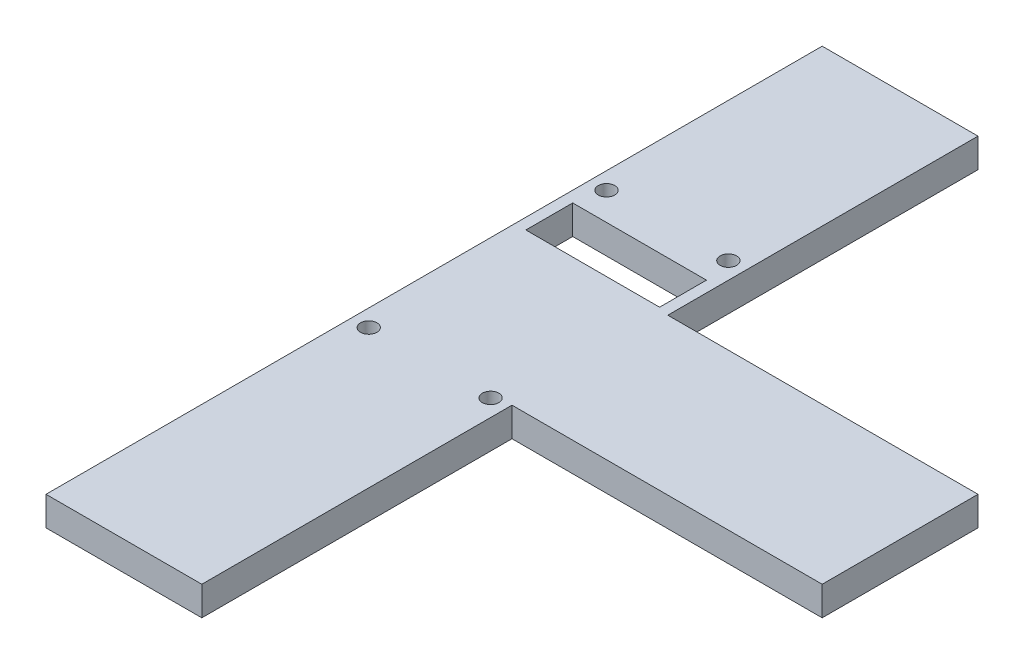
ISO-10303-21;
HEADER;
FILE_DESCRIPTION(('STEP AP214'),'2;1');
FILE_NAME('part.step','',(''),(''),'','','');
FILE_SCHEMA(('AUTOMOTIVE_DESIGN { 1 0 10303 214 1 1 1 1 }'));
ENDSEC;
DATA;
#1=APPLICATION_CONTEXT('core data for automotive mechanical design processes');
#2=APPLICATION_PROTOCOL_DEFINITION('international standard','automotive_design',2000,#1);
#3=PRODUCT_CONTEXT('',#1,'mechanical');
#4=PRODUCT('Part','Part','',(#3));
#5=PRODUCT_RELATED_PRODUCT_CATEGORY('part','',(#4));
#6=PRODUCT_DEFINITION_FORMATION('','',#4);
#7=PRODUCT_DEFINITION_CONTEXT('part definition',#1,'design');
#8=PRODUCT_DEFINITION('design','',#6,#7);
#9=PRODUCT_DEFINITION_SHAPE('','',#8);
#10=(LENGTH_UNIT() NAMED_UNIT(*) SI_UNIT(.MILLI.,.METRE.));
#11=(NAMED_UNIT(*) PLANE_ANGLE_UNIT() SI_UNIT($,.RADIAN.));
#12=(NAMED_UNIT(*) SI_UNIT($,.STERADIAN.) SOLID_ANGLE_UNIT());
#13=UNCERTAINTY_MEASURE_WITH_UNIT(LENGTH_MEASURE(1.E-05),#10,'distance_accuracy_value','');
#14=(GEOMETRIC_REPRESENTATION_CONTEXT(3) GLOBAL_UNCERTAINTY_ASSIGNED_CONTEXT((#13)) GLOBAL_UNIT_ASSIGNED_CONTEXT((#10,
#11,#12)) REPRESENTATION_CONTEXT('',''));
#15=CARTESIAN_POINT('',(0.,0.,0.));
#16=DIRECTION('',(0.,0.,1.));
#17=DIRECTION('',(1.,0.,0.));
#18=AXIS2_PLACEMENT_3D('',#15,#16,#17);
#19=CARTESIAN_POINT('',(0.,6.,0.));
#20=DIRECTION('',(0.,1.,0.));
#21=DIRECTION('',(0.,0.,1.));
#22=AXIS2_PLACEMENT_3D('',#19,#20,#21);
#23=PLANE('',#22);
#24=CARTESIAN_POINT('',(12.56,6.,12.97));
#25=DIRECTION('',(0.,1.,0.));
#26=DIRECTION('',(0.,0.,1.));
#27=AXIS2_PLACEMENT_3D('',#24,#25,#26);
#28=CIRCLE('',#27,1.7);
#29=CARTESIAN_POINT('',(12.56,6.,14.67));
#30=VERTEX_POINT('',#29);
#31=EDGE_CURVE('E480',#30,#30,#28,.T.);
#32=ORIENTED_EDGE('',*,*,#31,.F.);
#33=EDGE_LOOP('',(#32));
#34=FACE_BOUND('',#33,.T.);
#35=CARTESIAN_POINT('',(-12.56,6.,-36.04));
#36=DIRECTION('',(0.,1.,0.));
#37=DIRECTION('',(0.,0.,1.));
#38=AXIS2_PLACEMENT_3D('',#35,#36,#37);
#39=CIRCLE('',#38,1.7);
#40=CARTESIAN_POINT('',(-12.56,6.,-34.34));
#41=VERTEX_POINT('',#40);
#42=EDGE_CURVE('E164',#41,#41,#39,.T.);
#43=ORIENTED_EDGE('',*,*,#42,.F.);
#44=EDGE_LOOP('',(#43));
#45=FACE_BOUND('',#44,.T.);
#46=DIRECTION('',(-1.,0.,0.));
#47=VECTOR('',#46,1.);
#48=CARTESIAN_POINT('',(16.06,6.,-84.));
#49=LINE('',#48,#47);
#50=CARTESIAN_POINT('',(16.06,6.,-84.));
#51=VERTEX_POINT('',#50);
#52=CARTESIAN_POINT('',(-16.0600000000002,6.,-84.));
#53=VERTEX_POINT('',#52);
#54=EDGE_CURVE('E180',#51,#53,#49,.T.);
#55=ORIENTED_EDGE('',*,*,#54,.T.);
#56=DIRECTION('',(0.,0.,1.));
#57=VECTOR('',#56,1.);
#58=CARTESIAN_POINT('',(-16.0600000000002,6.,-84.));
#59=LINE('',#58,#57);
#60=CARTESIAN_POINT('',(-16.0600000000002,6.,76.));
#61=VERTEX_POINT('',#60);
#62=EDGE_CURVE('E183',#53,#61,#59,.T.);
#63=ORIENTED_EDGE('',*,*,#62,.T.);
#64=DIRECTION('',(1.,0.,0.));
#65=VECTOR('',#64,1.);
#66=CARTESIAN_POINT('',(-16.0600000000002,6.,76.));
#67=LINE('',#66,#65);
#68=CARTESIAN_POINT('',(16.06,6.,76.));
#69=VERTEX_POINT('',#68);
#70=EDGE_CURVE('E187',#61,#69,#67,.T.);
#71=ORIENTED_EDGE('',*,*,#70,.T.);
#72=DIRECTION('',(0.,0.,-1.));
#73=VECTOR('',#72,1.);
#74=CARTESIAN_POINT('',(16.06,6.,76.));
#75=LINE('',#74,#73);
#76=CARTESIAN_POINT('',(16.06,6.,12.06));
#77=VERTEX_POINT('',#76);
#78=EDGE_CURVE('E190',#69,#77,#75,.T.);
#79=ORIENTED_EDGE('',*,*,#78,.T.);
#80=DIRECTION('',(1.,0.,0.));
#81=VECTOR('',#80,1.);
#82=CARTESIAN_POINT('',(16.06,6.,12.06));
#83=LINE('',#82,#81);
#84=CARTESIAN_POINT('',(80.,6.,12.06));
#85=VERTEX_POINT('',#84);
#86=EDGE_CURVE('E193',#77,#85,#83,.T.);
#87=ORIENTED_EDGE('',*,*,#86,.T.);
#88=DIRECTION('',(0.,0.,-1.));
#89=VECTOR('',#88,1.);
#90=CARTESIAN_POINT('',(80.,6.,-4.00000000000001));
#91=LINE('',#90,#89);
#92=CARTESIAN_POINT('',(80.,6.,-20.06));
#93=VERTEX_POINT('',#92);
#94=EDGE_CURVE('E196',#85,#93,#91,.T.);
#95=ORIENTED_EDGE('',*,*,#94,.T.);
#96=DIRECTION('',(-1.,0.,0.));
#97=VECTOR('',#96,1.);
#98=CARTESIAN_POINT('',(80.,6.,-20.06));
#99=LINE('',#98,#97);
#100=CARTESIAN_POINT('',(16.06,6.,-20.06));
#101=VERTEX_POINT('',#100);
#102=EDGE_CURVE('E199',#93,#101,#99,.T.);
#103=ORIENTED_EDGE('',*,*,#102,.T.);
#104=DIRECTION('',(0.,0.,-1.));
#105=VECTOR('',#104,1.);
#106=CARTESIAN_POINT('',(16.06,6.,-20.06));
#107=LINE('',#106,#105);
#108=EDGE_CURVE('E202',#101,#51,#107,.T.);
#109=ORIENTED_EDGE('',*,*,#108,.T.);
#110=EDGE_LOOP('',(#55,#63,#71,#79,#87,#95,#103,#109));
#111=FACE_BOUND('',#110,.T.);
#112=DIRECTION('',(1.,0.,0.));
#113=VECTOR('',#112,1.);
#114=CARTESIAN_POINT('',(13.785,6.,-20.64));
#115=LINE('',#114,#113);
#116=CARTESIAN_POINT('',(-13.785,6.,-20.64));
#117=VERTEX_POINT('',#116);
#118=CARTESIAN_POINT('',(13.785,6.,-20.64));
#119=VERTEX_POINT('',#118);
#120=EDGE_CURVE('E138',#117,#119,#115,.T.);
#121=ORIENTED_EDGE('',*,*,#120,.F.);
#122=DIRECTION('',(0.,0.,1.));
#123=VECTOR('',#122,1.);
#124=CARTESIAN_POINT('',(-13.785,6.,-20.64));
#125=LINE('',#124,#123);
#126=CARTESIAN_POINT('',(-13.785,6.,-30.3));
#127=VERTEX_POINT('',#126);
#128=EDGE_CURVE('E129',#127,#117,#125,.T.);
#129=ORIENTED_EDGE('',*,*,#128,.F.);
#130=DIRECTION('',(-1.,0.,0.));
#131=VECTOR('',#130,1.);
#132=CARTESIAN_POINT('',(13.785,6.,-30.3));
#133=LINE('',#132,#131);
#134=CARTESIAN_POINT('',(13.785,6.,-30.3));
#135=VERTEX_POINT('',#134);
#136=EDGE_CURVE('E156',#135,#127,#133,.T.);
#137=ORIENTED_EDGE('',*,*,#136,.F.);
#138=DIRECTION('',(0.,0.,-1.));
#139=VECTOR('',#138,1.);
#140=CARTESIAN_POINT('',(13.785,6.,-20.64));
#141=LINE('',#140,#139);
#142=EDGE_CURVE('E152',#119,#135,#141,.T.);
#143=ORIENTED_EDGE('',*,*,#142,.F.);
#144=EDGE_LOOP('',(#121,#129,#137,#143));
#145=FACE_BOUND('',#144,.T.);
#146=CARTESIAN_POINT('',(12.56,6.,-36.04));
#147=DIRECTION('',(0.,1.,0.));
#148=DIRECTION('',(0.,0.,1.));
#149=AXIS2_PLACEMENT_3D('',#146,#147,#148);
#150=CIRCLE('',#149,1.7);
#151=CARTESIAN_POINT('',(12.56,6.,-34.34));
#152=VERTEX_POINT('',#151);
#153=EDGE_CURVE('E488',#152,#152,#150,.T.);
#154=ORIENTED_EDGE('',*,*,#153,.F.);
#155=EDGE_LOOP('',(#154));
#156=FACE_BOUND('',#155,.T.);
#157=CARTESIAN_POINT('',(-12.56,6.,12.97));
#158=DIRECTION('',(0.,1.,0.));
#159=DIRECTION('',(0.,0.,1.));
#160=AXIS2_PLACEMENT_3D('',#157,#158,#159);
#161=CIRCLE('',#160,1.7);
#162=CARTESIAN_POINT('',(-12.56,6.,14.67));
#163=VERTEX_POINT('',#162);
#164=EDGE_CURVE('E469',#163,#163,#161,.T.);
#165=ORIENTED_EDGE('',*,*,#164,.F.);
#166=EDGE_LOOP('',(#165));
#167=FACE_BOUND('',#166,.T.);
#168=ADVANCED_FACE('F39',(#34,#45,#111,#145,#156,#167),#23,.T.);
#169=CARTESIAN_POINT('',(0.,0.,0.));
#170=DIRECTION('',(0.,1.,0.));
#171=DIRECTION('',(0.,0.,1.));
#172=AXIS2_PLACEMENT_3D('',#169,#170,#171);
#173=PLANE('',#172);
#174=DIRECTION('',(-1.,0.,0.));
#175=VECTOR('',#174,1.);
#176=CARTESIAN_POINT('',(1.98438290654698E-13,0.,-84.));
#177=LINE('',#176,#175);
#178=CARTESIAN_POINT('',(16.06,0.,-84.));
#179=VERTEX_POINT('',#178);
#180=CARTESIAN_POINT('',(-16.0600000000002,0.,-84.));
#181=VERTEX_POINT('',#180);
#182=EDGE_CURVE('E147',#179,#181,#177,.T.);
#183=ORIENTED_EDGE('',*,*,#182,.F.);
#184=DIRECTION('',(0.,0.,-1.));
#185=VECTOR('',#184,1.);
#186=CARTESIAN_POINT('',(16.06,0.,-20.06));
#187=LINE('',#186,#185);
#188=CARTESIAN_POINT('',(16.06,0.,-20.06));
#189=VERTEX_POINT('',#188);
#190=EDGE_CURVE('E184',#189,#179,#187,.T.);
#191=ORIENTED_EDGE('',*,*,#190,.F.);
#192=DIRECTION('',(-1.,0.,0.));
#193=VECTOR('',#192,1.);
#194=CARTESIAN_POINT('',(80.,0.,-20.06));
#195=LINE('',#194,#193);
#196=CARTESIAN_POINT('',(80.,0.,-20.06));
#197=VERTEX_POINT('',#196);
#198=EDGE_CURVE('E226',#197,#189,#195,.T.);
#199=ORIENTED_EDGE('',*,*,#198,.F.);
#200=DIRECTION('',(0.,0.,-1.));
#201=VECTOR('',#200,1.);
#202=CARTESIAN_POINT('',(80.,0.,-4.00000000000001));
#203=LINE('',#202,#201);
#204=CARTESIAN_POINT('',(80.,0.,12.06));
#205=VERTEX_POINT('',#204);
#206=EDGE_CURVE('E223',#205,#197,#203,.T.);
#207=ORIENTED_EDGE('',*,*,#206,.F.);
#208=DIRECTION('',(1.,0.,0.));
#209=VECTOR('',#208,1.);
#210=CARTESIAN_POINT('',(16.06,0.,12.06));
#211=LINE('',#210,#209);
#212=CARTESIAN_POINT('',(16.06,0.,12.06));
#213=VERTEX_POINT('',#212);
#214=EDGE_CURVE('E219',#213,#205,#211,.T.);
#215=ORIENTED_EDGE('',*,*,#214,.F.);
#216=DIRECTION('',(0.,0.,-1.));
#217=VECTOR('',#216,1.);
#218=CARTESIAN_POINT('',(16.06,0.,76.));
#219=LINE('',#218,#217);
#220=CARTESIAN_POINT('',(16.06,0.,76.));
#221=VERTEX_POINT('',#220);
#222=EDGE_CURVE('E216',#221,#213,#219,.T.);
#223=ORIENTED_EDGE('',*,*,#222,.F.);
#224=DIRECTION('',(1.,0.,0.));
#225=VECTOR('',#224,1.);
#226=CARTESIAN_POINT('',(0.,0.,76.));
#227=LINE('',#226,#225);
#228=CARTESIAN_POINT('',(-16.0600000000002,0.,76.));
#229=VERTEX_POINT('',#228);
#230=EDGE_CURVE('E213',#229,#221,#227,.T.);
#231=ORIENTED_EDGE('',*,*,#230,.F.);
#232=DIRECTION('',(0.,0.,1.));
#233=VECTOR('',#232,1.);
#234=CARTESIAN_POINT('',(-16.0600000000001,0.,12.06));
#235=LINE('',#234,#233);
#236=EDGE_CURVE('E209',#181,#229,#235,.T.);
#237=ORIENTED_EDGE('',*,*,#236,.F.);
#238=EDGE_LOOP('',(#183,#191,#199,#207,#215,#223,#231,#237));
#239=FACE_BOUND('',#238,.T.);
#240=DIRECTION('',(0.,0.,1.));
#241=VECTOR('',#240,1.);
#242=CARTESIAN_POINT('',(-13.785,0.,-20.64));
#243=LINE('',#242,#241);
#244=CARTESIAN_POINT('',(-13.785,0.,-30.3));
#245=VERTEX_POINT('',#244);
#246=CARTESIAN_POINT('',(-13.785,0.,-20.64));
#247=VERTEX_POINT('',#246);
#248=EDGE_CURVE('E63',#245,#247,#243,.T.);
#249=ORIENTED_EDGE('',*,*,#248,.T.);
#250=DIRECTION('',(1.,0.,0.));
#251=VECTOR('',#250,1.);
#252=CARTESIAN_POINT('',(13.785,0.,-20.64));
#253=LINE('',#252,#251);
#254=CARTESIAN_POINT('',(13.785,0.,-20.64));
#255=VERTEX_POINT('',#254);
#256=EDGE_CURVE('E145',#247,#255,#253,.T.);
#257=ORIENTED_EDGE('',*,*,#256,.T.);
#258=DIRECTION('',(0.,0.,-1.));
#259=VECTOR('',#258,1.);
#260=CARTESIAN_POINT('',(13.785,0.,-20.64));
#261=LINE('',#260,#259);
#262=CARTESIAN_POINT('',(13.785,0.,-30.3));
#263=VERTEX_POINT('',#262);
#264=EDGE_CURVE('E167',#255,#263,#261,.T.);
#265=ORIENTED_EDGE('',*,*,#264,.T.);
#266=DIRECTION('',(-1.,0.,0.));
#267=VECTOR('',#266,1.);
#268=CARTESIAN_POINT('',(13.785,0.,-30.3));
#269=LINE('',#268,#267);
#270=EDGE_CURVE('E139',#263,#245,#269,.T.);
#271=ORIENTED_EDGE('',*,*,#270,.T.);
#272=EDGE_LOOP('',(#249,#257,#265,#271));
#273=FACE_BOUND('',#272,.T.);
#274=CARTESIAN_POINT('',(-12.56,0.,-36.04));
#275=DIRECTION('',(0.,1.,0.));
#276=DIRECTION('',(0.,0.,1.));
#277=AXIS2_PLACEMENT_3D('',#274,#275,#276);
#278=CIRCLE('',#277,1.7);
#279=CARTESIAN_POINT('',(-12.56,0.,-34.34));
#280=VERTEX_POINT('',#279);
#281=EDGE_CURVE('E492',#280,#280,#278,.T.);
#282=ORIENTED_EDGE('',*,*,#281,.T.);
#283=EDGE_LOOP('',(#282));
#284=FACE_BOUND('',#283,.T.);
#285=CARTESIAN_POINT('',(12.56,0.,-36.04));
#286=DIRECTION('',(0.,1.,0.));
#287=DIRECTION('',(0.,0.,1.));
#288=AXIS2_PLACEMENT_3D('',#285,#286,#287);
#289=CIRCLE('',#288,1.7);
#290=CARTESIAN_POINT('',(12.56,0.,-34.34));
#291=VERTEX_POINT('',#290);
#292=EDGE_CURVE('E484',#291,#291,#289,.T.);
#293=ORIENTED_EDGE('',*,*,#292,.T.);
#294=EDGE_LOOP('',(#293));
#295=FACE_BOUND('',#294,.T.);
#296=CARTESIAN_POINT('',(12.56,0.,12.97));
#297=DIRECTION('',(0.,1.,0.));
#298=DIRECTION('',(0.,0.,1.));
#299=AXIS2_PLACEMENT_3D('',#296,#297,#298);
#300=CIRCLE('',#299,1.7);
#301=CARTESIAN_POINT('',(12.56,0.,14.67));
#302=VERTEX_POINT('',#301);
#303=EDGE_CURVE('E477',#302,#302,#300,.T.);
#304=ORIENTED_EDGE('',*,*,#303,.T.);
#305=EDGE_LOOP('',(#304));
#306=FACE_BOUND('',#305,.T.);
#307=CARTESIAN_POINT('',(-12.56,0.,12.97));
#308=DIRECTION('',(0.,1.,0.));
#309=DIRECTION('',(0.,0.,1.));
#310=AXIS2_PLACEMENT_3D('',#307,#308,#309);
#311=CIRCLE('',#310,1.7);
#312=CARTESIAN_POINT('',(-12.56,0.,14.67));
#313=VERTEX_POINT('',#312);
#314=EDGE_CURVE('E472',#313,#313,#311,.T.);
#315=ORIENTED_EDGE('',*,*,#314,.T.);
#316=EDGE_LOOP('',(#315));
#317=FACE_BOUND('',#316,.T.);
#318=ADVANCED_FACE('F266',(#239,#273,#284,#295,#306,#317),#173,.F.);
#319=CARTESIAN_POINT('',(1.98438290654698E-13,6.,-84.));
#320=DIRECTION('',(0.,0.,1.));
#321=DIRECTION('',(1.,0.,0.));
#322=AXIS2_PLACEMENT_3D('',#319,#320,#321);
#323=PLANE('',#322);
#324=ORIENTED_EDGE('',*,*,#182,.T.);
#325=DIRECTION('',(0.,-1.,0.));
#326=VECTOR('',#325,1.);
#327=CARTESIAN_POINT('',(-16.0600000000002,6.,-84.));
#328=LINE('',#327,#326);
#329=EDGE_CURVE('E11',#53,#181,#328,.T.);
#330=ORIENTED_EDGE('',*,*,#329,.F.);
#331=ORIENTED_EDGE('',*,*,#54,.F.);
#332=DIRECTION('',(0.,-1.,0.));
#333=VECTOR('',#332,1.);
#334=CARTESIAN_POINT('',(16.06,6.,-84.));
#335=LINE('',#334,#333);
#336=EDGE_CURVE('E205',#51,#179,#335,.T.);
#337=ORIENTED_EDGE('',*,*,#336,.T.);
#338=EDGE_LOOP('',(#324,#330,#331,#337));
#339=FACE_BOUND('',#338,.T.);
#340=ADVANCED_FACE('F41',(#339),#323,.F.);
#341=CARTESIAN_POINT('',(-16.0600000000001,6.,12.06));
#342=DIRECTION('',(1.,0.,0.));
#343=DIRECTION('',(0.,0.,-1.));
#344=AXIS2_PLACEMENT_3D('',#341,#342,#343);
#345=PLANE('',#344);
#346=ORIENTED_EDGE('',*,*,#236,.T.);
#347=DIRECTION('',(0.,-1.,0.));
#348=VECTOR('',#347,1.);
#349=CARTESIAN_POINT('',(-16.0600000000002,6.,76.));
#350=LINE('',#349,#348);
#351=EDGE_CURVE('E48',#61,#229,#350,.T.);
#352=ORIENTED_EDGE('',*,*,#351,.F.);
#353=ORIENTED_EDGE('',*,*,#62,.F.);
#354=ORIENTED_EDGE('',*,*,#329,.T.);
#355=EDGE_LOOP('',(#346,#352,#353,#354));
#356=FACE_BOUND('',#355,.T.);
#357=ADVANCED_FACE('F263',(#356),#345,.F.);
#358=CARTESIAN_POINT('',(0.,6.,76.));
#359=DIRECTION('',(0.,0.,-1.));
#360=DIRECTION('',(-1.,0.,0.));
#361=AXIS2_PLACEMENT_3D('',#358,#359,#360);
#362=PLANE('',#361);
#363=ORIENTED_EDGE('',*,*,#230,.T.);
#364=DIRECTION('',(0.,-1.,0.));
#365=VECTOR('',#364,1.);
#366=CARTESIAN_POINT('',(16.06,6.,76.));
#367=LINE('',#366,#365);
#368=EDGE_CURVE('E251',#69,#221,#367,.T.);
#369=ORIENTED_EDGE('',*,*,#368,.F.);
#370=ORIENTED_EDGE('',*,*,#70,.F.);
#371=ORIENTED_EDGE('',*,*,#351,.T.);
#372=EDGE_LOOP('',(#363,#369,#370,#371));
#373=FACE_BOUND('',#372,.T.);
#374=ADVANCED_FACE('F259',(#373),#362,.F.);
#375=CARTESIAN_POINT('',(16.06,6.,76.));
#376=DIRECTION('',(-1.,0.,0.));
#377=DIRECTION('',(0.,0.,1.));
#378=AXIS2_PLACEMENT_3D('',#375,#376,#377);
#379=PLANE('',#378);
#380=ORIENTED_EDGE('',*,*,#222,.T.);
#381=DIRECTION('',(0.,-1.,0.));
#382=VECTOR('',#381,1.);
#383=CARTESIAN_POINT('',(16.06,6.,12.06));
#384=LINE('',#383,#382);
#385=EDGE_CURVE('E247',#77,#213,#384,.T.);
#386=ORIENTED_EDGE('',*,*,#385,.F.);
#387=ORIENTED_EDGE('',*,*,#78,.F.);
#388=ORIENTED_EDGE('',*,*,#368,.T.);
#389=EDGE_LOOP('',(#380,#386,#387,#388));
#390=FACE_BOUND('',#389,.T.);
#391=ADVANCED_FACE('F292',(#390),#379,.F.);
#392=CARTESIAN_POINT('',(16.06,6.,12.06));
#393=DIRECTION('',(0.,0.,-1.));
#394=DIRECTION('',(-1.,0.,0.));
#395=AXIS2_PLACEMENT_3D('',#392,#393,#394);
#396=PLANE('',#395);
#397=ORIENTED_EDGE('',*,*,#214,.T.);
#398=DIRECTION('',(0.,-1.,0.));
#399=VECTOR('',#398,1.);
#400=CARTESIAN_POINT('',(80.,6.,12.06));
#401=LINE('',#400,#399);
#402=EDGE_CURVE('E243',#85,#205,#401,.T.);
#403=ORIENTED_EDGE('',*,*,#402,.F.);
#404=ORIENTED_EDGE('',*,*,#86,.F.);
#405=ORIENTED_EDGE('',*,*,#385,.T.);
#406=EDGE_LOOP('',(#397,#403,#404,#405));
#407=FACE_BOUND('',#406,.T.);
#408=ADVANCED_FACE('F289',(#407),#396,.F.);
#409=CARTESIAN_POINT('',(80.,6.,-4.00000000000001));
#410=DIRECTION('',(-1.,0.,0.));
#411=DIRECTION('',(0.,0.,1.));
#412=AXIS2_PLACEMENT_3D('',#409,#410,#411);
#413=PLANE('',#412);
#414=ORIENTED_EDGE('',*,*,#206,.T.);
#415=DIRECTION('',(0.,-1.,0.));
#416=VECTOR('',#415,1.);
#417=CARTESIAN_POINT('',(80.,6.,-20.06));
#418=LINE('',#417,#416);
#419=EDGE_CURVE('E239',#93,#197,#418,.T.);
#420=ORIENTED_EDGE('',*,*,#419,.F.);
#421=ORIENTED_EDGE('',*,*,#94,.F.);
#422=ORIENTED_EDGE('',*,*,#402,.T.);
#423=EDGE_LOOP('',(#414,#420,#421,#422));
#424=FACE_BOUND('',#423,.T.);
#425=ADVANCED_FACE('F285',(#424),#413,.F.);
#426=CARTESIAN_POINT('',(80.,6.,-20.06));
#427=DIRECTION('',(0.,0.,1.));
#428=DIRECTION('',(1.,0.,0.));
#429=AXIS2_PLACEMENT_3D('',#426,#427,#428);
#430=PLANE('',#429);
#431=ORIENTED_EDGE('',*,*,#198,.T.);
#432=DIRECTION('',(0.,-1.,0.));
#433=VECTOR('',#432,1.);
#434=CARTESIAN_POINT('',(16.06,6.,-20.06));
#435=LINE('',#434,#433);
#436=EDGE_CURVE('E235',#101,#189,#435,.T.);
#437=ORIENTED_EDGE('',*,*,#436,.F.);
#438=ORIENTED_EDGE('',*,*,#102,.F.);
#439=ORIENTED_EDGE('',*,*,#419,.T.);
#440=EDGE_LOOP('',(#431,#437,#438,#439));
#441=FACE_BOUND('',#440,.T.);
#442=ADVANCED_FACE('F280',(#441),#430,.F.);
#443=CARTESIAN_POINT('',(16.06,6.,-20.06));
#444=DIRECTION('',(-1.,0.,0.));
#445=DIRECTION('',(0.,0.,1.));
#446=AXIS2_PLACEMENT_3D('',#443,#444,#445);
#447=PLANE('',#446);
#448=ORIENTED_EDGE('',*,*,#190,.T.);
#449=ORIENTED_EDGE('',*,*,#336,.F.);
#450=ORIENTED_EDGE('',*,*,#108,.F.);
#451=ORIENTED_EDGE('',*,*,#436,.T.);
#452=EDGE_LOOP('',(#448,#449,#450,#451));
#453=FACE_BOUND('',#452,.T.);
#454=ADVANCED_FACE('F275',(#453),#447,.F.);
#455=CARTESIAN_POINT('',(-13.785,6.,-20.64));
#456=DIRECTION('',(1.,0.,0.));
#457=DIRECTION('',(0.,0.,-1.));
#458=AXIS2_PLACEMENT_3D('',#455,#456,#457);
#459=PLANE('',#458);
#460=ORIENTED_EDGE('',*,*,#248,.F.);
#461=DIRECTION('',(0.,-1.,0.));
#462=VECTOR('',#461,1.);
#463=CARTESIAN_POINT('',(-13.785,6.,-30.3));
#464=LINE('',#463,#462);
#465=EDGE_CURVE('E133',#127,#245,#464,.T.);
#466=ORIENTED_EDGE('',*,*,#465,.F.);
#467=ORIENTED_EDGE('',*,*,#128,.T.);
#468=DIRECTION('',(0.,-1.,0.));
#469=VECTOR('',#468,1.);
#470=CARTESIAN_POINT('',(-13.785,6.,-20.64));
#471=LINE('',#470,#469);
#472=EDGE_CURVE('E132',#117,#247,#471,.T.);
#473=ORIENTED_EDGE('',*,*,#472,.T.);
#474=EDGE_LOOP('',(#460,#466,#467,#473));
#475=FACE_BOUND('',#474,.T.);
#476=ADVANCED_FACE('F131',(#475),#459,.T.);
#477=CARTESIAN_POINT('',(13.785,6.,-20.64));
#478=DIRECTION('',(0.,0.,-1.));
#479=DIRECTION('',(-1.,0.,0.));
#480=AXIS2_PLACEMENT_3D('',#477,#478,#479);
#481=PLANE('',#480);
#482=ORIENTED_EDGE('',*,*,#256,.F.);
#483=ORIENTED_EDGE('',*,*,#472,.F.);
#484=ORIENTED_EDGE('',*,*,#120,.T.);
#485=DIRECTION('',(0.,-1.,0.));
#486=VECTOR('',#485,1.);
#487=CARTESIAN_POINT('',(13.785,6.,-20.64));
#488=LINE('',#487,#486);
#489=EDGE_CURVE('E148',#119,#255,#488,.T.);
#490=ORIENTED_EDGE('',*,*,#489,.T.);
#491=EDGE_LOOP('',(#482,#483,#484,#490));
#492=FACE_BOUND('',#491,.T.);
#493=ADVANCED_FACE('F142',(#492),#481,.T.);
#494=CARTESIAN_POINT('',(13.785,6.,-20.64));
#495=DIRECTION('',(-1.,0.,0.));
#496=DIRECTION('',(0.,0.,1.));
#497=AXIS2_PLACEMENT_3D('',#494,#495,#496);
#498=PLANE('',#497);
#499=ORIENTED_EDGE('',*,*,#264,.F.);
#500=ORIENTED_EDGE('',*,*,#489,.F.);
#501=ORIENTED_EDGE('',*,*,#142,.T.);
#502=DIRECTION('',(0.,-1.,0.));
#503=VECTOR('',#502,1.);
#504=CARTESIAN_POINT('',(13.785,6.,-30.3));
#505=LINE('',#504,#503);
#506=EDGE_CURVE('E55',#135,#263,#505,.T.);
#507=ORIENTED_EDGE('',*,*,#506,.T.);
#508=EDGE_LOOP('',(#499,#500,#501,#507));
#509=FACE_BOUND('',#508,.T.);
#510=ADVANCED_FACE('F399',(#509),#498,.T.);
#511=CARTESIAN_POINT('',(13.785,6.,-30.3));
#512=DIRECTION('',(0.,0.,1.));
#513=DIRECTION('',(1.,0.,0.));
#514=AXIS2_PLACEMENT_3D('',#511,#512,#513);
#515=PLANE('',#514);
#516=ORIENTED_EDGE('',*,*,#270,.F.);
#517=ORIENTED_EDGE('',*,*,#506,.F.);
#518=ORIENTED_EDGE('',*,*,#136,.T.);
#519=ORIENTED_EDGE('',*,*,#465,.T.);
#520=EDGE_LOOP('',(#516,#517,#518,#519));
#521=FACE_BOUND('',#520,.T.);
#522=ADVANCED_FACE('F406',(#521),#515,.T.);
#523=CARTESIAN_POINT('',(-12.56,6.,-36.04));
#524=DIRECTION('',(0.,-1.,0.));
#525=DIRECTION('',(0.,0.,-1.));
#526=AXIS2_PLACEMENT_3D('',#523,#524,#525);
#527=CYLINDRICAL_SURFACE('',#526,1.7);
#528=ORIENTED_EDGE('',*,*,#42,.T.);
#529=EDGE_LOOP('',(#528));
#530=FACE_BOUND('',#529,.T.);
#531=ORIENTED_EDGE('',*,*,#281,.F.);
#532=EDGE_LOOP('',(#531));
#533=FACE_BOUND('',#532,.T.);
#534=ADVANCED_FACE('F415',(#530,#533),#527,.F.);
#535=CARTESIAN_POINT('',(12.56,6.,-36.04));
#536=DIRECTION('',(0.,-1.,0.));
#537=DIRECTION('',(0.,0.,-1.));
#538=AXIS2_PLACEMENT_3D('',#535,#536,#537);
#539=CYLINDRICAL_SURFACE('',#538,1.7);
#540=ORIENTED_EDGE('',*,*,#153,.T.);
#541=EDGE_LOOP('',(#540));
#542=FACE_BOUND('',#541,.T.);
#543=ORIENTED_EDGE('',*,*,#292,.F.);
#544=EDGE_LOOP('',(#543));
#545=FACE_BOUND('',#544,.T.);
#546=ADVANCED_FACE('F423',(#542,#545),#539,.F.);
#547=CARTESIAN_POINT('',(12.56,6.,12.97));
#548=DIRECTION('',(0.,-1.,0.));
#549=DIRECTION('',(0.,0.,-1.));
#550=AXIS2_PLACEMENT_3D('',#547,#548,#549);
#551=CYLINDRICAL_SURFACE('',#550,1.7);
#552=ORIENTED_EDGE('',*,*,#31,.T.);
#553=EDGE_LOOP('',(#552));
#554=FACE_BOUND('',#553,.T.);
#555=ORIENTED_EDGE('',*,*,#303,.F.);
#556=EDGE_LOOP('',(#555));
#557=FACE_BOUND('',#556,.T.);
#558=ADVANCED_FACE('F432',(#554,#557),#551,.F.);
#559=CARTESIAN_POINT('',(-12.56,6.,12.97));
#560=DIRECTION('',(0.,-1.,0.));
#561=DIRECTION('',(0.,0.,-1.));
#562=AXIS2_PLACEMENT_3D('',#559,#560,#561);
#563=CYLINDRICAL_SURFACE('',#562,1.7);
#564=ORIENTED_EDGE('',*,*,#164,.T.);
#565=EDGE_LOOP('',(#564));
#566=FACE_BOUND('',#565,.T.);
#567=ORIENTED_EDGE('',*,*,#314,.F.);
#568=EDGE_LOOP('',(#567));
#569=FACE_BOUND('',#568,.T.);
#570=ADVANCED_FACE('F441',(#566,#569),#563,.F.);
#571=CLOSED_SHELL('',(#168,#318,#340,#357,#374,#391,#408,#425,#442,#454,#476,#493,#510,#522,
#534,#546,#558,#570));
#572=MANIFOLD_SOLID_BREP('B2',#571);
#573=ADVANCED_BREP_SHAPE_REPRESENTATION('',(#18,#572),#14);
#574=SHAPE_DEFINITION_REPRESENTATION(#9,#573);
ENDSEC;
END-ISO-10303-21;
